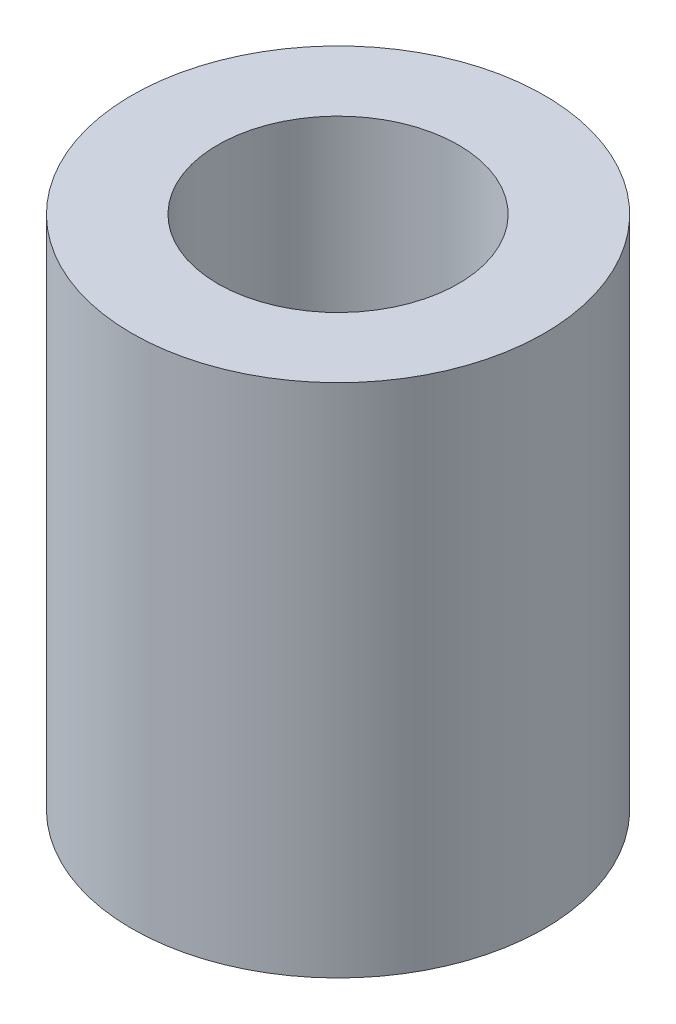
ISO-10303-21;
HEADER;
FILE_DESCRIPTION(('STEP AP214'),'2;1');
FILE_NAME('part.step','',(''),(''),'','','');
FILE_SCHEMA(('AUTOMOTIVE_DESIGN { 1 0 10303 214 1 1 1 1 }'));
ENDSEC;
DATA;
#1=APPLICATION_CONTEXT('core data for automotive mechanical design processes');
#2=APPLICATION_PROTOCOL_DEFINITION('international standard','automotive_design',2000,#1);
#3=PRODUCT_CONTEXT('',#1,'mechanical');
#4=PRODUCT('Part','Part','',(#3));
#5=PRODUCT_RELATED_PRODUCT_CATEGORY('part','',(#4));
#6=PRODUCT_DEFINITION_FORMATION('','',#4);
#7=PRODUCT_DEFINITION_CONTEXT('part definition',#1,'design');
#8=PRODUCT_DEFINITION('design','',#6,#7);
#9=PRODUCT_DEFINITION_SHAPE('','',#8);
#10=(LENGTH_UNIT() NAMED_UNIT(*) SI_UNIT(.MILLI.,.METRE.));
#11=(NAMED_UNIT(*) PLANE_ANGLE_UNIT() SI_UNIT($,.RADIAN.));
#12=(NAMED_UNIT(*) SI_UNIT($,.STERADIAN.) SOLID_ANGLE_UNIT());
#13=UNCERTAINTY_MEASURE_WITH_UNIT(LENGTH_MEASURE(1.E-05),#10,'distance_accuracy_value','');
#14=(GEOMETRIC_REPRESENTATION_CONTEXT(3) GLOBAL_UNCERTAINTY_ASSIGNED_CONTEXT((#13)) GLOBAL_UNIT_ASSIGNED_CONTEXT((#10,
#11,#12)) REPRESENTATION_CONTEXT('',''));
#15=CARTESIAN_POINT('',(0.,0.,0.));
#16=DIRECTION('',(0.,0.,1.));
#17=DIRECTION('',(1.,0.,0.));
#18=AXIS2_PLACEMENT_3D('',#15,#16,#17);
#19=CARTESIAN_POINT('',(0.,15.,0.));
#20=DIRECTION('',(0.,1.,0.));
#21=DIRECTION('',(0.,0.,1.));
#22=AXIS2_PLACEMENT_3D('',#19,#20,#21);
#23=PLANE('',#22);
#24=CARTESIAN_POINT('',(0.,15.,0.));
#25=DIRECTION('',(0.,1.,0.));
#26=DIRECTION('',(0.,0.,1.));
#27=AXIS2_PLACEMENT_3D('',#24,#25,#26);
#28=CIRCLE('',#27,6.);
#29=CARTESIAN_POINT('',(0.,15.,6.));
#30=VERTEX_POINT('',#29);
#31=EDGE_CURVE('E10',#30,#30,#28,.T.);
#32=ORIENTED_EDGE('',*,*,#31,.T.);
#33=EDGE_LOOP('',(#32));
#34=FACE_BOUND('',#33,.T.);
#35=CARTESIAN_POINT('',(0.,15.,0.));
#36=DIRECTION('',(0.,1.,0.));
#37=DIRECTION('',(0.,0.,1.));
#38=AXIS2_PLACEMENT_3D('',#35,#36,#37);
#39=CIRCLE('',#38,3.5);
#40=CARTESIAN_POINT('',(0.,15.,3.5));
#41=VERTEX_POINT('',#40);
#42=EDGE_CURVE('E52',#41,#41,#39,.T.);
#43=ORIENTED_EDGE('',*,*,#42,.F.);
#44=EDGE_LOOP('',(#43));
#45=FACE_BOUND('',#44,.T.);
#46=ADVANCED_FACE('F38',(#34,#45),#23,.T.);
#47=CARTESIAN_POINT('',(0.,0.,0.));
#48=DIRECTION('',(0.,1.,0.));
#49=DIRECTION('',(0.,0.,1.));
#50=AXIS2_PLACEMENT_3D('',#47,#48,#49);
#51=PLANE('',#50);
#52=CARTESIAN_POINT('',(0.,0.,0.));
#53=DIRECTION('',(0.,1.,0.));
#54=DIRECTION('',(0.,0.,1.));
#55=AXIS2_PLACEMENT_3D('',#52,#53,#54);
#56=CIRCLE('',#55,6.);
#57=CARTESIAN_POINT('',(0.,0.,6.));
#58=VERTEX_POINT('',#57);
#59=EDGE_CURVE('E42',#58,#58,#56,.T.);
#60=ORIENTED_EDGE('',*,*,#59,.F.);
#61=EDGE_LOOP('',(#60));
#62=FACE_BOUND('',#61,.T.);
#63=CARTESIAN_POINT('',(0.,0.,0.));
#64=DIRECTION('',(0.,1.,0.));
#65=DIRECTION('',(0.,0.,1.));
#66=AXIS2_PLACEMENT_3D('',#63,#64,#65);
#67=CIRCLE('',#66,3.5);
#68=CARTESIAN_POINT('',(0.,0.,3.5));
#69=VERTEX_POINT('',#68);
#70=EDGE_CURVE('E54',#69,#69,#67,.T.);
#71=ORIENTED_EDGE('',*,*,#70,.T.);
#72=EDGE_LOOP('',(#71));
#73=FACE_BOUND('',#72,.T.);
#74=ADVANCED_FACE('F67',(#62,#73),#51,.F.);
#75=CARTESIAN_POINT('',(0.,15.,0.));
#76=DIRECTION('',(0.,-1.,0.));
#77=DIRECTION('',(0.,0.,-1.));
#78=AXIS2_PLACEMENT_3D('',#75,#76,#77);
#79=CYLINDRICAL_SURFACE('',#78,6.);
#80=ORIENTED_EDGE('',*,*,#31,.F.);
#81=EDGE_LOOP('',(#80));
#82=FACE_BOUND('',#81,.T.);
#83=ORIENTED_EDGE('',*,*,#59,.T.);
#84=EDGE_LOOP('',(#83));
#85=FACE_BOUND('',#84,.T.);
#86=ADVANCED_FACE('F40',(#82,#85),#79,.T.);
#87=CARTESIAN_POINT('',(0.,15.,0.));
#88=DIRECTION('',(0.,-1.,0.));
#89=DIRECTION('',(0.,0.,-1.));
#90=AXIS2_PLACEMENT_3D('',#87,#88,#89);
#91=CYLINDRICAL_SURFACE('',#90,3.5);
#92=ORIENTED_EDGE('',*,*,#42,.T.);
#93=EDGE_LOOP('',(#92));
#94=FACE_BOUND('',#93,.T.);
#95=ORIENTED_EDGE('',*,*,#70,.F.);
#96=EDGE_LOOP('',(#95));
#97=FACE_BOUND('',#96,.T.);
#98=ADVANCED_FACE('F63',(#94,#97),#91,.F.);
#99=CLOSED_SHELL('',(#46,#74,#86,#98));
#100=MANIFOLD_SOLID_BREP('B2',#99);
#101=ADVANCED_BREP_SHAPE_REPRESENTATION('',(#18,#100),#14);
#102=SHAPE_DEFINITION_REPRESENTATION(#9,#101);
ENDSEC;
END-ISO-10303-21;
